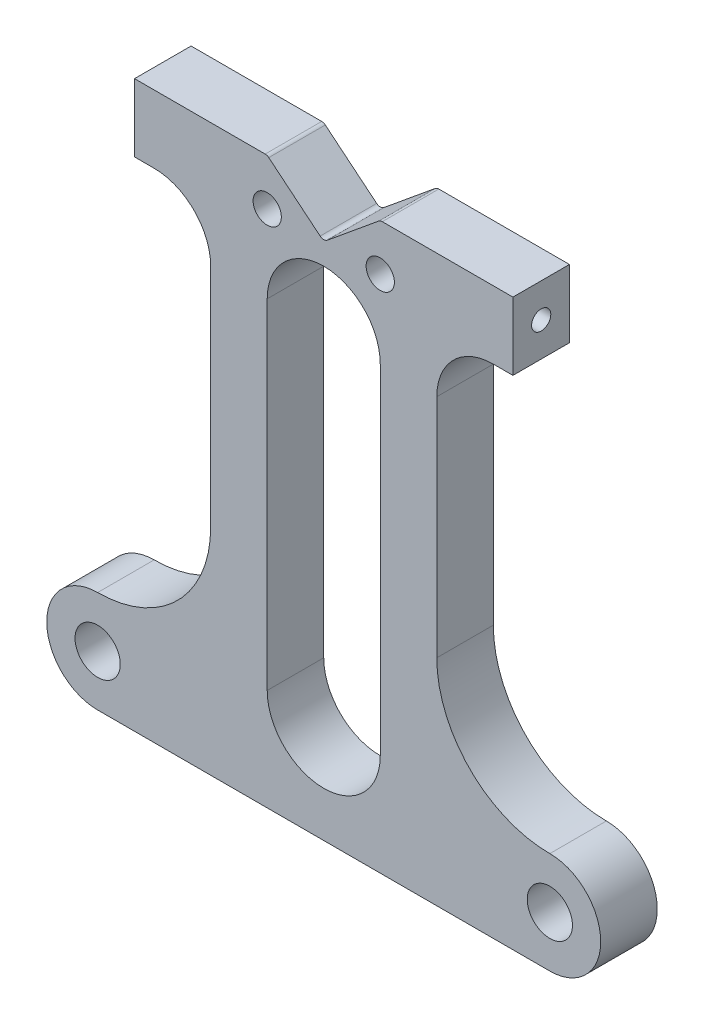
ISO-10303-21;
HEADER;
FILE_DESCRIPTION(('STEP AP214'),'2;1');
FILE_NAME('part.step','',(''),(''),'','','');
FILE_SCHEMA(('AUTOMOTIVE_DESIGN { 1 0 10303 214 1 1 1 1 }'));
ENDSEC;
DATA;
#1=APPLICATION_CONTEXT('core data for automotive mechanical design processes');
#2=APPLICATION_PROTOCOL_DEFINITION('international standard','automotive_design',2000,#1);
#3=PRODUCT_CONTEXT('',#1,'mechanical');
#4=PRODUCT('Part','Part','',(#3));
#5=PRODUCT_RELATED_PRODUCT_CATEGORY('part','',(#4));
#6=PRODUCT_DEFINITION_FORMATION('','',#4);
#7=PRODUCT_DEFINITION_CONTEXT('part definition',#1,'design');
#8=PRODUCT_DEFINITION('design','',#6,#7);
#9=PRODUCT_DEFINITION_SHAPE('','',#8);
#10=(LENGTH_UNIT() NAMED_UNIT(*) SI_UNIT(.MILLI.,.METRE.));
#11=(NAMED_UNIT(*) PLANE_ANGLE_UNIT() SI_UNIT($,.RADIAN.));
#12=(NAMED_UNIT(*) SI_UNIT($,.STERADIAN.) SOLID_ANGLE_UNIT());
#13=UNCERTAINTY_MEASURE_WITH_UNIT(LENGTH_MEASURE(1.E-05),#10,'distance_accuracy_value','');
#14=(GEOMETRIC_REPRESENTATION_CONTEXT(3) GLOBAL_UNCERTAINTY_ASSIGNED_CONTEXT((#13)) GLOBAL_UNIT_ASSIGNED_CONTEXT((#10,
#11,#12)) REPRESENTATION_CONTEXT('',''));
#15=CARTESIAN_POINT('',(0.,0.,0.));
#16=DIRECTION('',(0.,0.,1.));
#17=DIRECTION('',(1.,0.,0.));
#18=AXIS2_PLACEMENT_3D('',#15,#16,#17);
#19=CARTESIAN_POINT('',(0.,-9.00000000000001,5.));
#20=DIRECTION('',(0.,-1.,0.));
#21=DIRECTION('',(1.,0.,0.));
#22=AXIS2_PLACEMENT_3D('',#19,#20,#21);
#23=PLANE('',#22);
#24=DIRECTION('',(-1.,0.,0.));
#25=VECTOR('',#24,1.);
#26=CARTESIAN_POINT('',(0.,-9.00000000000001,-5.));
#27=LINE('',#26,#25);
#28=CARTESIAN_POINT('',(40.,-9.,-5.));
#29=VERTEX_POINT('',#28);
#30=CARTESIAN_POINT('',(-40.,-9.,-5.));
#31=VERTEX_POINT('',#30);
#32=EDGE_CURVE('E338',#29,#31,#27,.T.);
#33=ORIENTED_EDGE('',*,*,#32,.F.);
#34=DIRECTION('',(0.,0.,-1.));
#35=VECTOR('',#34,1.);
#36=CARTESIAN_POINT('',(40.,-9.,5.));
#37=LINE('',#36,#35);
#38=CARTESIAN_POINT('',(40.,-9.,5.));
#39=VERTEX_POINT('',#38);
#40=EDGE_CURVE('E465',#39,#29,#37,.T.);
#41=ORIENTED_EDGE('',*,*,#40,.F.);
#42=DIRECTION('',(-1.,0.,0.));
#43=VECTOR('',#42,1.);
#44=CARTESIAN_POINT('',(0.,-9.00000000000001,5.));
#45=LINE('',#44,#43);
#46=CARTESIAN_POINT('',(-40.,-9.,5.));
#47=VERTEX_POINT('',#46);
#48=EDGE_CURVE('E339',#39,#47,#45,.T.);
#49=ORIENTED_EDGE('',*,*,#48,.T.);
#50=DIRECTION('',(0.,0.,-1.));
#51=VECTOR('',#50,1.);
#52=CARTESIAN_POINT('',(-40.,-9.,5.));
#53=LINE('',#52,#51);
#54=EDGE_CURVE('E269',#47,#31,#53,.T.);
#55=ORIENTED_EDGE('',*,*,#54,.T.);
#56=EDGE_LOOP('',(#33,#41,#49,#55));
#57=FACE_BOUND('',#56,.T.);
#58=ADVANCED_FACE('F47',(#57),#23,.T.);
#59=CARTESIAN_POINT('',(40.,0.,5.));
#60=DIRECTION('',(0.,0.,-1.));
#61=DIRECTION('',(-1.,0.,0.));
#62=AXIS2_PLACEMENT_3D('',#59,#60,#61);
#63=CYLINDRICAL_SURFACE('',#62,9.);
#64=CARTESIAN_POINT('',(40.,0.,-5.));
#65=DIRECTION('',(0.,0.,1.));
#66=DIRECTION('',(1.,0.,0.));
#67=AXIS2_PLACEMENT_3D('',#64,#65,#66);
#68=CIRCLE('',#67,9.);
#69=CARTESIAN_POINT('',(40.,9.,-5.));
#70=VERTEX_POINT('',#69);
#71=EDGE_CURVE('E393',#29,#70,#68,.T.);
#72=ORIENTED_EDGE('',*,*,#71,.T.);
#73=DIRECTION('',(0.,0.,-1.));
#74=VECTOR('',#73,1.);
#75=CARTESIAN_POINT('',(40.,9.,5.));
#76=LINE('',#75,#74);
#77=CARTESIAN_POINT('',(40.,9.,5.));
#78=VERTEX_POINT('',#77);
#79=EDGE_CURVE('E462',#78,#70,#76,.T.);
#80=ORIENTED_EDGE('',*,*,#79,.F.);
#81=CARTESIAN_POINT('',(40.,0.,5.));
#82=DIRECTION('',(0.,0.,1.));
#83=DIRECTION('',(1.,0.,0.));
#84=AXIS2_PLACEMENT_3D('',#81,#82,#83);
#85=CIRCLE('',#84,9.);
#86=EDGE_CURVE('E342',#39,#78,#85,.T.);
#87=ORIENTED_EDGE('',*,*,#86,.F.);
#88=ORIENTED_EDGE('',*,*,#40,.T.);
#89=EDGE_LOOP('',(#72,#80,#87,#88));
#90=FACE_BOUND('',#89,.T.);
#91=ADVANCED_FACE('F565',(#90),#63,.T.);
#92=CARTESIAN_POINT('',(40.,29.,5.));
#93=DIRECTION('',(0.,0.,-1.));
#94=DIRECTION('',(-1.,0.,0.));
#95=AXIS2_PLACEMENT_3D('',#92,#93,#94);
#96=CYLINDRICAL_SURFACE('',#95,20.);
#97=CARTESIAN_POINT('',(40.,29.,-5.));
#98=DIRECTION('',(0.,0.,1.));
#99=DIRECTION('',(1.,0.,0.));
#100=AXIS2_PLACEMENT_3D('',#97,#98,#99);
#101=CIRCLE('',#100,20.);
#102=CARTESIAN_POINT('',(20.,29.,-5.));
#103=VERTEX_POINT('',#102);
#104=EDGE_CURVE('E397',#103,#70,#101,.T.);
#105=ORIENTED_EDGE('',*,*,#104,.F.);
#106=DIRECTION('',(0.,0.,-1.));
#107=VECTOR('',#106,1.);
#108=CARTESIAN_POINT('',(20.,29.,5.));
#109=LINE('',#108,#107);
#110=CARTESIAN_POINT('',(20.,29.,5.));
#111=VERTEX_POINT('',#110);
#112=EDGE_CURVE('E459',#111,#103,#109,.T.);
#113=ORIENTED_EDGE('',*,*,#112,.F.);
#114=CARTESIAN_POINT('',(40.,29.,5.));
#115=DIRECTION('',(0.,0.,1.));
#116=DIRECTION('',(1.,0.,0.));
#117=AXIS2_PLACEMENT_3D('',#114,#115,#116);
#118=CIRCLE('',#117,20.);
#119=EDGE_CURVE('E346',#111,#78,#118,.T.);
#120=ORIENTED_EDGE('',*,*,#119,.T.);
#121=ORIENTED_EDGE('',*,*,#79,.T.);
#122=EDGE_LOOP('',(#105,#113,#120,#121));
#123=FACE_BOUND('',#122,.T.);
#124=ADVANCED_FACE('F569',(#123),#96,.F.);
#125=CARTESIAN_POINT('',(20.,0.,5.));
#126=DIRECTION('',(1.,0.,0.));
#127=DIRECTION('',(0.,1.,0.));
#128=AXIS2_PLACEMENT_3D('',#125,#126,#127);
#129=PLANE('',#128);
#130=DIRECTION('',(0.,-1.,0.));
#131=VECTOR('',#130,1.);
#132=CARTESIAN_POINT('',(20.,0.,-5.));
#133=LINE('',#132,#131);
#134=CARTESIAN_POINT('',(20.,69.,-5.));
#135=VERTEX_POINT('',#134);
#136=EDGE_CURVE('E401',#135,#103,#133,.T.);
#137=ORIENTED_EDGE('',*,*,#136,.F.);
#138=DIRECTION('',(0.,0.,-1.));
#139=VECTOR('',#138,1.);
#140=CARTESIAN_POINT('',(20.,69.,5.));
#141=LINE('',#140,#139);
#142=CARTESIAN_POINT('',(20.,69.,5.));
#143=VERTEX_POINT('',#142);
#144=EDGE_CURVE('E456',#143,#135,#141,.T.);
#145=ORIENTED_EDGE('',*,*,#144,.F.);
#146=DIRECTION('',(0.,-1.,0.));
#147=VECTOR('',#146,1.);
#148=CARTESIAN_POINT('',(20.,0.,5.));
#149=LINE('',#148,#147);
#150=EDGE_CURVE('E350',#143,#111,#149,.T.);
#151=ORIENTED_EDGE('',*,*,#150,.T.);
#152=ORIENTED_EDGE('',*,*,#112,.T.);
#153=EDGE_LOOP('',(#137,#145,#151,#152));
#154=FACE_BOUND('',#153,.T.);
#155=ADVANCED_FACE('F572',(#154),#129,.T.);
#156=CARTESIAN_POINT('',(30.,69.,5.));
#157=DIRECTION('',(0.,0.,-1.));
#158=DIRECTION('',(-1.,0.,0.));
#159=AXIS2_PLACEMENT_3D('',#156,#157,#158);
#160=CYLINDRICAL_SURFACE('',#159,10.);
#161=CARTESIAN_POINT('',(30.,69.,-5.));
#162=DIRECTION('',(0.,0.,1.));
#163=DIRECTION('',(1.,0.,0.));
#164=AXIS2_PLACEMENT_3D('',#161,#162,#163);
#165=CIRCLE('',#164,10.);
#166=CARTESIAN_POINT('',(30.,79.,-5.));
#167=VERTEX_POINT('',#166);
#168=EDGE_CURVE('E405',#135,#167,#165,.F.);
#169=ORIENTED_EDGE('',*,*,#168,.T.);
#170=DIRECTION('',(0.,0.,-1.));
#171=VECTOR('',#170,1.);
#172=CARTESIAN_POINT('',(30.,79.,5.));
#173=LINE('',#172,#171);
#174=CARTESIAN_POINT('',(30.,79.,5.));
#175=VERTEX_POINT('',#174);
#176=EDGE_CURVE('E453',#175,#167,#173,.T.);
#177=ORIENTED_EDGE('',*,*,#176,.F.);
#178=CARTESIAN_POINT('',(30.,69.,5.));
#179=DIRECTION('',(0.,0.,1.));
#180=DIRECTION('',(1.,0.,0.));
#181=AXIS2_PLACEMENT_3D('',#178,#179,#180);
#182=CIRCLE('',#181,10.);
#183=EDGE_CURVE('E354',#143,#175,#182,.F.);
#184=ORIENTED_EDGE('',*,*,#183,.F.);
#185=ORIENTED_EDGE('',*,*,#144,.T.);
#186=EDGE_LOOP('',(#169,#177,#184,#185));
#187=FACE_BOUND('',#186,.T.);
#188=ADVANCED_FACE('F578',(#187),#160,.F.);
#189=CARTESIAN_POINT('',(3.15949635970416E-13,79.0000000000001,5.));
#190=DIRECTION('',(0.,-1.,0.));
#191=DIRECTION('',(1.,0.,0.));
#192=AXIS2_PLACEMENT_3D('',#189,#190,#191);
#193=PLANE('',#192);
#194=DIRECTION('',(-1.,0.,0.));
#195=VECTOR('',#194,1.);
#196=CARTESIAN_POINT('',(3.15949635970416E-13,79.0000000000001,-5.));
#197=LINE('',#196,#195);
#198=CARTESIAN_POINT('',(33.47,79.,-5.));
#199=VERTEX_POINT('',#198);
#200=EDGE_CURVE('E409',#199,#167,#197,.T.);
#201=ORIENTED_EDGE('',*,*,#200,.F.);
#202=DIRECTION('',(0.,0.,-1.));
#203=VECTOR('',#202,1.);
#204=CARTESIAN_POINT('',(33.47,79.,5.));
#205=LINE('',#204,#203);
#206=CARTESIAN_POINT('',(33.47,79.,5.));
#207=VERTEX_POINT('',#206);
#208=EDGE_CURVE('E450',#207,#199,#205,.T.);
#209=ORIENTED_EDGE('',*,*,#208,.F.);
#210=DIRECTION('',(-1.,0.,0.));
#211=VECTOR('',#210,1.);
#212=CARTESIAN_POINT('',(3.15949635970416E-13,79.0000000000001,5.));
#213=LINE('',#212,#211);
#214=EDGE_CURVE('E357',#207,#175,#213,.T.);
#215=ORIENTED_EDGE('',*,*,#214,.T.);
#216=ORIENTED_EDGE('',*,*,#176,.T.);
#217=EDGE_LOOP('',(#201,#209,#215,#216));
#218=FACE_BOUND('',#217,.T.);
#219=ADVANCED_FACE('F582',(#218),#193,.T.);
#220=CARTESIAN_POINT('',(33.47,0.,5.));
#221=DIRECTION('',(1.,0.,0.));
#222=DIRECTION('',(0.,0.,-1.));
#223=AXIS2_PLACEMENT_3D('',#220,#221,#222);
#224=PLANE('',#223);
#225=CARTESIAN_POINT('',(33.47,85.,0.));
#226=DIRECTION('',(1.,0.,0.));
#227=DIRECTION('',(0.,0.,-1.));
#228=AXIS2_PLACEMENT_3D('',#225,#226,#227);
#229=CIRCLE('',#228,1.69999999999999);
#230=CARTESIAN_POINT('',(33.47,85.,-1.69999999999999));
#231=VERTEX_POINT('',#230);
#232=EDGE_CURVE('E220',#231,#231,#229,.T.);
#233=ORIENTED_EDGE('',*,*,#232,.F.);
#234=EDGE_LOOP('',(#233));
#235=FACE_BOUND('',#234,.T.);
#236=DIRECTION('',(0.,-1.,0.));
#237=VECTOR('',#236,1.);
#238=CARTESIAN_POINT('',(33.47,0.,-5.));
#239=LINE('',#238,#237);
#240=CARTESIAN_POINT('',(33.47,91.,-5.));
#241=VERTEX_POINT('',#240);
#242=EDGE_CURVE('E413',#241,#199,#239,.T.);
#243=ORIENTED_EDGE('',*,*,#242,.F.);
#244=DIRECTION('',(0.,0.,-1.));
#245=VECTOR('',#244,1.);
#246=CARTESIAN_POINT('',(33.47,91.,5.));
#247=LINE('',#246,#245);
#248=CARTESIAN_POINT('',(33.47,91.,5.));
#249=VERTEX_POINT('',#248);
#250=EDGE_CURVE('E446',#249,#241,#247,.T.);
#251=ORIENTED_EDGE('',*,*,#250,.F.);
#252=DIRECTION('',(0.,-1.,0.));
#253=VECTOR('',#252,1.);
#254=CARTESIAN_POINT('',(33.47,0.,5.));
#255=LINE('',#254,#253);
#256=EDGE_CURVE('E361',#249,#207,#255,.T.);
#257=ORIENTED_EDGE('',*,*,#256,.T.);
#258=ORIENTED_EDGE('',*,*,#208,.T.);
#259=EDGE_LOOP('',(#243,#251,#257,#258));
#260=FACE_BOUND('',#259,.T.);
#261=ADVANCED_FACE('F585',(#235,#260),#224,.T.);
#262=CARTESIAN_POINT('',(0.,91.,5.));
#263=DIRECTION('',(0.,1.,0.));
#264=DIRECTION('',(0.,0.,1.));
#265=AXIS2_PLACEMENT_3D('',#262,#263,#264);
#266=PLANE('',#265);
#267=DIRECTION('',(1.,0.,0.));
#268=VECTOR('',#267,1.);
#269=CARTESIAN_POINT('',(0.,91.,-5.));
#270=LINE('',#269,#268);
#271=CARTESIAN_POINT('',(10.3583764703025,91.,-5.));
#272=VERTEX_POINT('',#271);
#273=EDGE_CURVE('E417',#272,#241,#270,.T.);
#274=ORIENTED_EDGE('',*,*,#273,.F.);
#275=DIRECTION('',(0.,0.,-1.));
#276=VECTOR('',#275,1.);
#277=CARTESIAN_POINT('',(10.3583764703025,91.,5.));
#278=LINE('',#277,#276);
#279=CARTESIAN_POINT('',(10.3583764703025,91.,5.));
#280=VERTEX_POINT('',#279);
#281=EDGE_CURVE('E63',#272,#280,#278,.F.);
#282=ORIENTED_EDGE('',*,*,#281,.T.);
#283=DIRECTION('',(1.,0.,0.));
#284=VECTOR('',#283,1.);
#285=CARTESIAN_POINT('',(0.,91.,5.));
#286=LINE('',#285,#284);
#287=EDGE_CURVE('E365',#280,#249,#286,.T.);
#288=ORIENTED_EDGE('',*,*,#287,.T.);
#289=ORIENTED_EDGE('',*,*,#250,.T.);
#290=EDGE_LOOP('',(#274,#282,#288,#289));
#291=FACE_BOUND('',#290,.T.);
#292=ADVANCED_FACE('F668',(#291),#266,.T.);
#293=CARTESIAN_POINT('',(-40.6091273121016,49.3804002149911,5.));
#294=DIRECTION('',(-0.635175060900593,0.772368203650259,0.));
#295=DIRECTION('',(-0.772368203650259,-0.635175060900593,0.));
#296=AXIS2_PLACEMENT_3D('',#293,#294,#295);
#297=PLANE('',#296);
#298=DIRECTION('',(0.772368203650259,0.635175060900593,0.));
#299=VECTOR('',#298,1.);
#300=CARTESIAN_POINT('',(-40.6091273121016,49.3804002149911,-5.));
#301=LINE('',#300,#299);
#302=CARTESIAN_POINT('',(0.635175060900599,83.2986171324715,-5.));
#303=VERTEX_POINT('',#302);
#304=CARTESIAN_POINT('',(9.72320140940192,90.7723682036503,-5.));
#305=VERTEX_POINT('',#304);
#306=EDGE_CURVE('E420',#303,#305,#301,.T.);
#307=ORIENTED_EDGE('',*,*,#306,.F.);
#308=DIRECTION('',(0.,0.,-1.));
#309=VECTOR('',#308,1.);
#310=CARTESIAN_POINT('',(0.635175060900599,83.2986171324715,5.));
#311=LINE('',#310,#309);
#312=CARTESIAN_POINT('',(0.635175060900599,83.2986171324715,5.));
#313=VERTEX_POINT('',#312);
#314=EDGE_CURVE('E479',#303,#313,#311,.F.);
#315=ORIENTED_EDGE('',*,*,#314,.T.);
#316=DIRECTION('',(0.772368203650259,0.635175060900593,0.));
#317=VECTOR('',#316,1.);
#318=CARTESIAN_POINT('',(-40.6091273121016,49.3804002149911,5.));
#319=LINE('',#318,#317);
#320=CARTESIAN_POINT('',(9.72320140940192,90.7723682036503,5.));
#321=VERTEX_POINT('',#320);
#322=EDGE_CURVE('E368',#313,#321,#319,.T.);
#323=ORIENTED_EDGE('',*,*,#322,.T.);
#324=DIRECTION('',(0.,0.,-1.));
#325=VECTOR('',#324,1.);
#326=CARTESIAN_POINT('',(9.72320140940192,90.7723682036503,5.));
#327=LINE('',#326,#325);
#328=EDGE_CURVE('E475',#321,#305,#327,.T.);
#329=ORIENTED_EDGE('',*,*,#328,.T.);
#330=EDGE_LOOP('',(#307,#315,#323,#329));
#331=FACE_BOUND('',#330,.T.);
#332=ADVANCED_FACE('F508',(#331),#297,.T.);
#333=CARTESIAN_POINT('',(0.,69.,5.));
#334=DIRECTION('',(0.,0.,-1.));
#335=DIRECTION('',(-1.,0.,0.));
#336=AXIS2_PLACEMENT_3D('',#333,#334,#335);
#337=CYLINDRICAL_SURFACE('',#336,10.);
#338=CARTESIAN_POINT('',(0.,69.,-5.));
#339=DIRECTION('',(0.,0.,1.));
#340=DIRECTION('',(1.,0.,0.));
#341=AXIS2_PLACEMENT_3D('',#338,#339,#340);
#342=CIRCLE('',#341,10.);
#343=CARTESIAN_POINT('',(10.,69.,-5.));
#344=VERTEX_POINT('',#343);
#345=CARTESIAN_POINT('',(-10.,69.,-5.));
#346=VERTEX_POINT('',#345);
#347=EDGE_CURVE('E423',#344,#346,#342,.T.);
#348=ORIENTED_EDGE('',*,*,#347,.F.);
#349=DIRECTION('',(0.,0.,-1.));
#350=VECTOR('',#349,1.);
#351=CARTESIAN_POINT('',(10.,69.,5.));
#352=LINE('',#351,#350);
#353=CARTESIAN_POINT('',(10.,69.,5.));
#354=VERTEX_POINT('',#353);
#355=EDGE_CURVE('E443',#354,#344,#352,.T.);
#356=ORIENTED_EDGE('',*,*,#355,.F.);
#357=CARTESIAN_POINT('',(0.,69.,5.));
#358=DIRECTION('',(0.,0.,1.));
#359=DIRECTION('',(1.,0.,0.));
#360=AXIS2_PLACEMENT_3D('',#357,#358,#359);
#361=CIRCLE('',#360,10.);
#362=CARTESIAN_POINT('',(-10.,69.,5.));
#363=VERTEX_POINT('',#362);
#364=EDGE_CURVE('E372',#354,#363,#361,.T.);
#365=ORIENTED_EDGE('',*,*,#364,.T.);
#366=DIRECTION('',(0.,0.,-1.));
#367=VECTOR('',#366,1.);
#368=CARTESIAN_POINT('',(-10.,69.,5.));
#369=LINE('',#368,#367);
#370=EDGE_CURVE('E330',#363,#346,#369,.T.);
#371=ORIENTED_EDGE('',*,*,#370,.T.);
#372=EDGE_LOOP('',(#348,#356,#365,#371));
#373=FACE_BOUND('',#372,.T.);
#374=ADVANCED_FACE('F662',(#373),#337,.F.);
#375=CARTESIAN_POINT('',(10.,0.,5.));
#376=DIRECTION('',(1.,0.,0.));
#377=DIRECTION('',(0.,1.,0.));
#378=AXIS2_PLACEMENT_3D('',#375,#376,#377);
#379=PLANE('',#378);
#380=DIRECTION('',(0.,-1.,0.));
#381=VECTOR('',#380,1.);
#382=CARTESIAN_POINT('',(10.,0.,-5.));
#383=LINE('',#382,#381);
#384=CARTESIAN_POINT('',(10.,9.00000000000001,-5.));
#385=VERTEX_POINT('',#384);
#386=EDGE_CURVE('E426',#344,#385,#383,.T.);
#387=ORIENTED_EDGE('',*,*,#386,.T.);
#388=DIRECTION('',(0.,0.,-1.));
#389=VECTOR('',#388,1.);
#390=CARTESIAN_POINT('',(10.,9.00000000000001,5.));
#391=LINE('',#390,#389);
#392=CARTESIAN_POINT('',(10.,9.00000000000001,5.));
#393=VERTEX_POINT('',#392);
#394=EDGE_CURVE('E390',#393,#385,#391,.T.);
#395=ORIENTED_EDGE('',*,*,#394,.F.);
#396=DIRECTION('',(0.,-1.,0.));
#397=VECTOR('',#396,1.);
#398=CARTESIAN_POINT('',(10.,0.,5.));
#399=LINE('',#398,#397);
#400=EDGE_CURVE('E375',#354,#393,#399,.T.);
#401=ORIENTED_EDGE('',*,*,#400,.F.);
#402=ORIENTED_EDGE('',*,*,#355,.T.);
#403=EDGE_LOOP('',(#387,#395,#401,#402));
#404=FACE_BOUND('',#403,.T.);
#405=ADVANCED_FACE('F658',(#404),#379,.F.);
#406=CARTESIAN_POINT('',(0.,9.00000000000001,5.));
#407=DIRECTION('',(0.,0.,-1.));
#408=DIRECTION('',(-1.,0.,0.));
#409=AXIS2_PLACEMENT_3D('',#406,#407,#408);
#410=CYLINDRICAL_SURFACE('',#409,10.);
#411=CARTESIAN_POINT('',(0.,9.00000000000001,-5.));
#412=DIRECTION('',(0.,0.,1.));
#413=DIRECTION('',(1.,0.,0.));
#414=AXIS2_PLACEMENT_3D('',#411,#412,#413);
#415=CIRCLE('',#414,10.);
#416=CARTESIAN_POINT('',(-10.,9.00000000000001,-5.));
#417=VERTEX_POINT('',#416);
#418=EDGE_CURVE('E430',#417,#385,#415,.T.);
#419=ORIENTED_EDGE('',*,*,#418,.F.);
#420=DIRECTION('',(0.,0.,-1.));
#421=VECTOR('',#420,1.);
#422=CARTESIAN_POINT('',(-10.,9.00000000000001,5.));
#423=LINE('',#422,#421);
#424=CARTESIAN_POINT('',(-10.,9.00000000000001,5.));
#425=VERTEX_POINT('',#424);
#426=EDGE_CURVE('E334',#425,#417,#423,.T.);
#427=ORIENTED_EDGE('',*,*,#426,.F.);
#428=CARTESIAN_POINT('',(0.,9.00000000000001,5.));
#429=DIRECTION('',(0.,0.,1.));
#430=DIRECTION('',(1.,0.,0.));
#431=AXIS2_PLACEMENT_3D('',#428,#429,#430);
#432=CIRCLE('',#431,10.);
#433=EDGE_CURVE('E378',#425,#393,#432,.T.);
#434=ORIENTED_EDGE('',*,*,#433,.T.);
#435=ORIENTED_EDGE('',*,*,#394,.T.);
#436=EDGE_LOOP('',(#419,#427,#434,#435));
#437=FACE_BOUND('',#436,.T.);
#438=ADVANCED_FACE('F654',(#437),#410,.F.);
#439=CARTESIAN_POINT('',(10.,82.7762660619803,5.));
#440=DIRECTION('',(0.,0.,-1.));
#441=DIRECTION('',(-1.,0.,0.));
#442=AXIS2_PLACEMENT_3D('',#439,#440,#441);
#443=CYLINDRICAL_SURFACE('',#442,2.5);
#444=CARTESIAN_POINT('',(10.,82.7762660619803,5.));
#445=DIRECTION('',(0.,0.,1.));
#446=DIRECTION('',(1.,0.,0.));
#447=AXIS2_PLACEMENT_3D('',#444,#445,#446);
#448=CIRCLE('',#447,2.5);
#449=CARTESIAN_POINT('',(12.5,82.7762660619803,5.));
#450=VERTEX_POINT('',#449);
#451=EDGE_CURVE('E382',#450,#450,#448,.T.);
#452=ORIENTED_EDGE('',*,*,#451,.T.);
#453=EDGE_LOOP('',(#452));
#454=FACE_BOUND('',#453,.T.);
#455=CARTESIAN_POINT('',(10.,82.7762660619803,-5.));
#456=DIRECTION('',(0.,0.,1.));
#457=DIRECTION('',(1.,0.,0.));
#458=AXIS2_PLACEMENT_3D('',#455,#456,#457);
#459=CIRCLE('',#458,2.5);
#460=CARTESIAN_POINT('',(12.5,82.7762660619803,-5.));
#461=VERTEX_POINT('',#460);
#462=EDGE_CURVE('E434',#461,#461,#459,.T.);
#463=ORIENTED_EDGE('',*,*,#462,.F.);
#464=EDGE_LOOP('',(#463));
#465=FACE_BOUND('',#464,.T.);
#466=ADVANCED_FACE('F650',(#454,#465),#443,.F.);
#467=CARTESIAN_POINT('',(40.,0.,5.));
#468=DIRECTION('',(0.,0.,-1.));
#469=DIRECTION('',(-1.,0.,0.));
#470=AXIS2_PLACEMENT_3D('',#467,#468,#469);
#471=CYLINDRICAL_SURFACE('',#470,4.);
#472=CARTESIAN_POINT('',(40.,0.,5.));
#473=DIRECTION('',(0.,0.,1.));
#474=DIRECTION('',(1.,0.,0.));
#475=AXIS2_PLACEMENT_3D('',#472,#473,#474);
#476=CIRCLE('',#475,4.);
#477=CARTESIAN_POINT('',(44.,0.,5.));
#478=VERTEX_POINT('',#477);
#479=EDGE_CURVE('E386',#478,#478,#476,.T.);
#480=ORIENTED_EDGE('',*,*,#479,.T.);
#481=EDGE_LOOP('',(#480));
#482=FACE_BOUND('',#481,.T.);
#483=CARTESIAN_POINT('',(40.,0.,-5.));
#484=DIRECTION('',(0.,0.,1.));
#485=DIRECTION('',(1.,0.,0.));
#486=AXIS2_PLACEMENT_3D('',#483,#484,#485);
#487=CIRCLE('',#486,4.);
#488=CARTESIAN_POINT('',(44.,0.,-5.));
#489=VERTEX_POINT('',#488);
#490=EDGE_CURVE('E343',#489,#489,#487,.T.);
#491=ORIENTED_EDGE('',*,*,#490,.F.);
#492=EDGE_LOOP('',(#491));
#493=FACE_BOUND('',#492,.T.);
#494=ADVANCED_FACE('F644',(#482,#493),#471,.F.);
#495=CARTESIAN_POINT('',(0.,0.,5.));
#496=DIRECTION('',(0.,0.,1.));
#497=DIRECTION('',(1.,0.,0.));
#498=AXIS2_PLACEMENT_3D('',#495,#496,#497);
#499=PLANE('',#498);
#500=ORIENTED_EDGE('',*,*,#433,.F.);
#501=DIRECTION('',(0.,-1.,0.));
#502=VECTOR('',#501,1.);
#503=CARTESIAN_POINT('',(-10.,0.,5.));
#504=LINE('',#503,#502);
#505=EDGE_CURVE('E230',#363,#425,#504,.T.);
#506=ORIENTED_EDGE('',*,*,#505,.F.);
#507=ORIENTED_EDGE('',*,*,#364,.F.);
#508=ORIENTED_EDGE('',*,*,#400,.T.);
#509=EDGE_LOOP('',(#500,#506,#507,#508));
#510=FACE_BOUND('',#509,.T.);
#511=DIRECTION('',(-0.772368203650259,0.635175060900593,0.));
#512=VECTOR('',#511,1.);
#513=CARTESIAN_POINT('',(40.6091273121016,49.3804002149911,5.));
#514=LINE('',#513,#512);
#515=CARTESIAN_POINT('',(-0.635175060900599,83.2986171324715,5.));
#516=VERTEX_POINT('',#515);
#517=CARTESIAN_POINT('',(-9.72320140940192,90.7723682036503,5.));
#518=VERTEX_POINT('',#517);
#519=EDGE_CURVE('E234',#516,#518,#514,.T.);
#520=ORIENTED_EDGE('',*,*,#519,.T.);
#521=CARTESIAN_POINT('',(-10.3583764703025,90.,5.));
#522=DIRECTION('',(0.,0.,1.));
#523=DIRECTION('',(1.,0.,0.));
#524=AXIS2_PLACEMENT_3D('',#521,#522,#523);
#525=CIRCLE('',#524,1.);
#526=CARTESIAN_POINT('',(-10.3583764703025,91.,5.));
#527=VERTEX_POINT('',#526);
#528=EDGE_CURVE('E494',#518,#527,#525,.T.);
#529=ORIENTED_EDGE('',*,*,#528,.T.);
#530=DIRECTION('',(-1.,0.,0.));
#531=VECTOR('',#530,1.);
#532=CARTESIAN_POINT('',(0.,91.,5.));
#533=LINE('',#532,#531);
#534=CARTESIAN_POINT('',(-33.47,91.,5.));
#535=VERTEX_POINT('',#534);
#536=EDGE_CURVE('E239',#527,#535,#533,.T.);
#537=ORIENTED_EDGE('',*,*,#536,.T.);
#538=DIRECTION('',(0.,-1.,0.));
#539=VECTOR('',#538,1.);
#540=CARTESIAN_POINT('',(-33.47,0.,5.));
#541=LINE('',#540,#539);
#542=CARTESIAN_POINT('',(-33.47,79.,5.));
#543=VERTEX_POINT('',#542);
#544=EDGE_CURVE('E242',#535,#543,#541,.T.);
#545=ORIENTED_EDGE('',*,*,#544,.T.);
#546=DIRECTION('',(1.,0.,0.));
#547=VECTOR('',#546,1.);
#548=CARTESIAN_POINT('',(-3.15949635970416E-13,79.0000000000001,5.));
#549=LINE('',#548,#547);
#550=CARTESIAN_POINT('',(-30.,79.,5.));
#551=VERTEX_POINT('',#550);
#552=EDGE_CURVE('E245',#543,#551,#549,.T.);
#553=ORIENTED_EDGE('',*,*,#552,.T.);
#554=CARTESIAN_POINT('',(-30.,69.,5.));
#555=DIRECTION('',(0.,0.,-1.));
#556=DIRECTION('',(-1.,0.,0.));
#557=AXIS2_PLACEMENT_3D('',#554,#555,#556);
#558=CIRCLE('',#557,10.);
#559=CARTESIAN_POINT('',(-20.,69.,5.));
#560=VERTEX_POINT('',#559);
#561=EDGE_CURVE('E248',#560,#551,#558,.F.);
#562=ORIENTED_EDGE('',*,*,#561,.F.);
#563=DIRECTION('',(0.,-1.,0.));
#564=VECTOR('',#563,1.);
#565=CARTESIAN_POINT('',(-20.,0.,5.));
#566=LINE('',#565,#564);
#567=CARTESIAN_POINT('',(-20.,29.,5.));
#568=VERTEX_POINT('',#567);
#569=EDGE_CURVE('E252',#560,#568,#566,.T.);
#570=ORIENTED_EDGE('',*,*,#569,.T.);
#571=CARTESIAN_POINT('',(-40.,29.,5.));
#572=DIRECTION('',(0.,0.,-1.));
#573=DIRECTION('',(-1.,0.,0.));
#574=AXIS2_PLACEMENT_3D('',#571,#572,#573);
#575=CIRCLE('',#574,20.);
#576=CARTESIAN_POINT('',(-40.,9.,5.));
#577=VERTEX_POINT('',#576);
#578=EDGE_CURVE('E255',#568,#577,#575,.T.);
#579=ORIENTED_EDGE('',*,*,#578,.T.);
#580=CARTESIAN_POINT('',(-40.,0.,5.));
#581=DIRECTION('',(0.,0.,-1.));
#582=DIRECTION('',(-1.,0.,0.));
#583=AXIS2_PLACEMENT_3D('',#580,#581,#582);
#584=CIRCLE('',#583,9.);
#585=EDGE_CURVE('E258',#47,#577,#584,.T.);
#586=ORIENTED_EDGE('',*,*,#585,.F.);
#587=ORIENTED_EDGE('',*,*,#48,.F.);
#588=ORIENTED_EDGE('',*,*,#86,.T.);
#589=ORIENTED_EDGE('',*,*,#119,.F.);
#590=ORIENTED_EDGE('',*,*,#150,.F.);
#591=ORIENTED_EDGE('',*,*,#183,.T.);
#592=ORIENTED_EDGE('',*,*,#214,.F.);
#593=ORIENTED_EDGE('',*,*,#256,.F.);
#594=ORIENTED_EDGE('',*,*,#287,.F.);
#595=CARTESIAN_POINT('',(10.3583764703025,90.,5.));
#596=DIRECTION('',(0.,0.,1.));
#597=DIRECTION('',(1.,0.,0.));
#598=AXIS2_PLACEMENT_3D('',#595,#596,#597);
#599=CIRCLE('',#598,1.);
#600=EDGE_CURVE('E491',#280,#321,#599,.T.);
#601=ORIENTED_EDGE('',*,*,#600,.T.);
#602=ORIENTED_EDGE('',*,*,#322,.F.);
#603=CARTESIAN_POINT('',(0.,84.0709853361218,5.));
#604=DIRECTION('',(0.,0.,1.));
#605=DIRECTION('',(1.,0.,0.));
#606=AXIS2_PLACEMENT_3D('',#603,#604,#605);
#607=CIRCLE('',#606,1.);
#608=EDGE_CURVE('E11',#313,#516,#607,.F.);
#609=ORIENTED_EDGE('',*,*,#608,.T.);
#610=EDGE_LOOP('',(#520,#529,#537,#545,#553,#562,#570,#579,#586,#587,#588,#589,#590,#591,#592,
#593,#594,#601,#602,#609));
#611=FACE_BOUND('',#610,.T.);
#612=ORIENTED_EDGE('',*,*,#451,.F.);
#613=EDGE_LOOP('',(#612));
#614=FACE_BOUND('',#613,.T.);
#615=ORIENTED_EDGE('',*,*,#479,.F.);
#616=EDGE_LOOP('',(#615));
#617=FACE_BOUND('',#616,.T.);
#618=CARTESIAN_POINT('',(-10.,82.7762660619803,5.));
#619=DIRECTION('',(0.,0.,-1.));
#620=DIRECTION('',(-1.,0.,0.));
#621=AXIS2_PLACEMENT_3D('',#618,#619,#620);
#622=CIRCLE('',#621,2.5);
#623=CARTESIAN_POINT('',(-12.5,82.7762660619803,5.));
#624=VERTEX_POINT('',#623);
#625=EDGE_CURVE('E262',#624,#624,#622,.T.);
#626=ORIENTED_EDGE('',*,*,#625,.T.);
#627=EDGE_LOOP('',(#626));
#628=FACE_BOUND('',#627,.T.);
#629=CARTESIAN_POINT('',(-40.,0.,5.));
#630=DIRECTION('',(0.,0.,-1.));
#631=DIRECTION('',(-1.,0.,0.));
#632=AXIS2_PLACEMENT_3D('',#629,#630,#631);
#633=CIRCLE('',#632,4.);
#634=CARTESIAN_POINT('',(-44.,0.,5.));
#635=VERTEX_POINT('',#634);
#636=EDGE_CURVE('E266',#635,#635,#633,.T.);
#637=ORIENTED_EDGE('',*,*,#636,.T.);
#638=EDGE_LOOP('',(#637));
#639=FACE_BOUND('',#638,.T.);
#640=ADVANCED_FACE('F515',(#510,#611,#614,#617,#628,#639),#499,.T.);
#641=CARTESIAN_POINT('',(0.,0.,-5.));
#642=DIRECTION('',(0.,0.,1.));
#643=DIRECTION('',(1.,0.,0.));
#644=AXIS2_PLACEMENT_3D('',#641,#642,#643);
#645=PLANE('',#644);
#646=DIRECTION('',(0.,-1.,0.));
#647=VECTOR('',#646,1.);
#648=CARTESIAN_POINT('',(-10.,0.,-5.));
#649=LINE('',#648,#647);
#650=EDGE_CURVE('E219',#346,#417,#649,.T.);
#651=ORIENTED_EDGE('',*,*,#650,.T.);
#652=ORIENTED_EDGE('',*,*,#418,.T.);
#653=ORIENTED_EDGE('',*,*,#386,.F.);
#654=ORIENTED_EDGE('',*,*,#347,.T.);
#655=EDGE_LOOP('',(#651,#652,#653,#654));
#656=FACE_BOUND('',#655,.T.);
#657=DIRECTION('',(-1.,0.,0.));
#658=VECTOR('',#657,1.);
#659=CARTESIAN_POINT('',(0.,91.,-5.));
#660=LINE('',#659,#658);
#661=CARTESIAN_POINT('',(-10.3583764703025,91.,-5.));
#662=VERTEX_POINT('',#661);
#663=CARTESIAN_POINT('',(-33.47,91.,-5.));
#664=VERTEX_POINT('',#663);
#665=EDGE_CURVE('E274',#662,#664,#660,.T.);
#666=ORIENTED_EDGE('',*,*,#665,.F.);
#667=CARTESIAN_POINT('',(-10.3583764703025,90.,-5.));
#668=DIRECTION('',(0.,0.,1.));
#669=DIRECTION('',(1.,0.,0.));
#670=AXIS2_PLACEMENT_3D('',#667,#668,#669);
#671=CIRCLE('',#670,1.);
#672=CARTESIAN_POINT('',(-9.72320140940192,90.7723682036503,-5.));
#673=VERTEX_POINT('',#672);
#674=EDGE_CURVE('E488',#662,#673,#671,.F.);
#675=ORIENTED_EDGE('',*,*,#674,.T.);
#676=DIRECTION('',(-0.772368203650259,0.635175060900593,0.));
#677=VECTOR('',#676,1.);
#678=CARTESIAN_POINT('',(40.6091273121016,49.3804002149911,-5.));
#679=LINE('',#678,#677);
#680=CARTESIAN_POINT('',(-0.635175060900599,83.2986171324715,-5.));
#681=VERTEX_POINT('',#680);
#682=EDGE_CURVE('E225',#681,#673,#679,.T.);
#683=ORIENTED_EDGE('',*,*,#682,.F.);
#684=CARTESIAN_POINT('',(0.,84.0709853361218,-5.));
#685=DIRECTION('',(0.,0.,1.));
#686=DIRECTION('',(1.,0.,0.));
#687=AXIS2_PLACEMENT_3D('',#684,#685,#686);
#688=CIRCLE('',#687,1.);
#689=EDGE_CURVE('E56',#681,#303,#688,.T.);
#690=ORIENTED_EDGE('',*,*,#689,.T.);
#691=ORIENTED_EDGE('',*,*,#306,.T.);
#692=CARTESIAN_POINT('',(10.3583764703025,90.,-5.));
#693=DIRECTION('',(0.,0.,1.));
#694=DIRECTION('',(1.,0.,0.));
#695=AXIS2_PLACEMENT_3D('',#692,#693,#694);
#696=CIRCLE('',#695,1.);
#697=EDGE_CURVE('E71',#305,#272,#696,.F.);
#698=ORIENTED_EDGE('',*,*,#697,.T.);
#699=ORIENTED_EDGE('',*,*,#273,.T.);
#700=ORIENTED_EDGE('',*,*,#242,.T.);
#701=ORIENTED_EDGE('',*,*,#200,.T.);
#702=ORIENTED_EDGE('',*,*,#168,.F.);
#703=ORIENTED_EDGE('',*,*,#136,.T.);
#704=ORIENTED_EDGE('',*,*,#104,.T.);
#705=ORIENTED_EDGE('',*,*,#71,.F.);
#706=ORIENTED_EDGE('',*,*,#32,.T.);
#707=CARTESIAN_POINT('',(-40.,0.,-5.));
#708=DIRECTION('',(0.,0.,-1.));
#709=DIRECTION('',(-1.,0.,0.));
#710=AXIS2_PLACEMENT_3D('',#707,#708,#709);
#711=CIRCLE('',#710,9.);
#712=CARTESIAN_POINT('',(-40.,9.,-5.));
#713=VERTEX_POINT('',#712);
#714=EDGE_CURVE('E295',#31,#713,#711,.T.);
#715=ORIENTED_EDGE('',*,*,#714,.T.);
#716=CARTESIAN_POINT('',(-40.,29.,-5.));
#717=DIRECTION('',(0.,0.,-1.));
#718=DIRECTION('',(-1.,0.,0.));
#719=AXIS2_PLACEMENT_3D('',#716,#717,#718);
#720=CIRCLE('',#719,20.);
#721=CARTESIAN_POINT('',(-20.,29.,-5.));
#722=VERTEX_POINT('',#721);
#723=EDGE_CURVE('E291',#722,#713,#720,.T.);
#724=ORIENTED_EDGE('',*,*,#723,.F.);
#725=DIRECTION('',(0.,-1.,0.));
#726=VECTOR('',#725,1.);
#727=CARTESIAN_POINT('',(-20.,0.,-5.));
#728=LINE('',#727,#726);
#729=CARTESIAN_POINT('',(-20.,69.,-5.));
#730=VERTEX_POINT('',#729);
#731=EDGE_CURVE('E288',#730,#722,#728,.T.);
#732=ORIENTED_EDGE('',*,*,#731,.F.);
#733=CARTESIAN_POINT('',(-30.,69.,-5.));
#734=DIRECTION('',(0.,0.,-1.));
#735=DIRECTION('',(-1.,0.,0.));
#736=AXIS2_PLACEMENT_3D('',#733,#734,#735);
#737=CIRCLE('',#736,10.);
#738=CARTESIAN_POINT('',(-30.,79.,-5.));
#739=VERTEX_POINT('',#738);
#740=EDGE_CURVE('E284',#730,#739,#737,.F.);
#741=ORIENTED_EDGE('',*,*,#740,.T.);
#742=DIRECTION('',(1.,0.,0.));
#743=VECTOR('',#742,1.);
#744=CARTESIAN_POINT('',(-3.15949635970416E-13,79.0000000000001,-5.));
#745=LINE('',#744,#743);
#746=CARTESIAN_POINT('',(-33.47,79.,-5.));
#747=VERTEX_POINT('',#746);
#748=EDGE_CURVE('E280',#747,#739,#745,.T.);
#749=ORIENTED_EDGE('',*,*,#748,.F.);
#750=DIRECTION('',(0.,-1.,0.));
#751=VECTOR('',#750,1.);
#752=CARTESIAN_POINT('',(-33.47,0.,-5.));
#753=LINE('',#752,#751);
#754=EDGE_CURVE('E277',#664,#747,#753,.T.);
#755=ORIENTED_EDGE('',*,*,#754,.F.);
#756=EDGE_LOOP('',(#666,#675,#683,#690,#691,#698,#699,#700,#701,#702,#703,#704,#705,#706,#715,
#724,#732,#741,#749,#755));
#757=FACE_BOUND('',#756,.T.);
#758=ORIENTED_EDGE('',*,*,#462,.T.);
#759=EDGE_LOOP('',(#758));
#760=FACE_BOUND('',#759,.T.);
#761=ORIENTED_EDGE('',*,*,#490,.T.);
#762=EDGE_LOOP('',(#761));
#763=FACE_BOUND('',#762,.T.);
#764=CARTESIAN_POINT('',(-10.,82.7762660619803,-5.));
#765=DIRECTION('',(0.,0.,-1.));
#766=DIRECTION('',(-1.,0.,0.));
#767=AXIS2_PLACEMENT_3D('',#764,#765,#766);
#768=CIRCLE('',#767,2.5);
#769=CARTESIAN_POINT('',(-12.5,82.7762660619803,-5.));
#770=VERTEX_POINT('',#769);
#771=EDGE_CURVE('E299',#770,#770,#768,.T.);
#772=ORIENTED_EDGE('',*,*,#771,.F.);
#773=EDGE_LOOP('',(#772));
#774=FACE_BOUND('',#773,.T.);
#775=CARTESIAN_POINT('',(-40.,0.,-5.));
#776=DIRECTION('',(0.,0.,-1.));
#777=DIRECTION('',(-1.,0.,0.));
#778=AXIS2_PLACEMENT_3D('',#775,#776,#777);
#779=CIRCLE('',#778,4.);
#780=CARTESIAN_POINT('',(-44.,0.,-5.));
#781=VERTEX_POINT('',#780);
#782=EDGE_CURVE('E235',#781,#781,#779,.T.);
#783=ORIENTED_EDGE('',*,*,#782,.F.);
#784=EDGE_LOOP('',(#783));
#785=FACE_BOUND('',#784,.T.);
#786=ADVANCED_FACE('F502',(#656,#757,#760,#763,#774,#785),#645,.F.);
#787=CARTESIAN_POINT('',(-10.,0.,5.));
#788=DIRECTION('',(1.,0.,0.));
#789=DIRECTION('',(0.,1.,0.));
#790=AXIS2_PLACEMENT_3D('',#787,#788,#789);
#791=PLANE('',#790);
#792=ORIENTED_EDGE('',*,*,#650,.F.);
#793=ORIENTED_EDGE('',*,*,#370,.F.);
#794=ORIENTED_EDGE('',*,*,#505,.T.);
#795=ORIENTED_EDGE('',*,*,#426,.T.);
#796=EDGE_LOOP('',(#792,#793,#794,#795));
#797=FACE_BOUND('',#796,.T.);
#798=ADVANCED_FACE('F638',(#797),#791,.T.);
#799=CARTESIAN_POINT('',(40.6091273121016,49.3804002149911,5.));
#800=DIRECTION('',(-0.635175060900593,-0.772368203650259,0.));
#801=DIRECTION('',(0.772368203650259,-0.635175060900593,0.));
#802=AXIS2_PLACEMENT_3D('',#799,#800,#801);
#803=PLANE('',#802);
#804=ORIENTED_EDGE('',*,*,#519,.F.);
#805=DIRECTION('',(0.,0.,-1.));
#806=VECTOR('',#805,1.);
#807=CARTESIAN_POINT('',(-0.635175060900599,83.2986171324715,5.));
#808=LINE('',#807,#806);
#809=EDGE_CURVE('E471',#516,#681,#808,.T.);
#810=ORIENTED_EDGE('',*,*,#809,.T.);
#811=ORIENTED_EDGE('',*,*,#682,.T.);
#812=DIRECTION('',(0.,0.,-1.));
#813=VECTOR('',#812,1.);
#814=CARTESIAN_POINT('',(-9.72320140940192,90.7723682036503,5.));
#815=LINE('',#814,#813);
#816=EDGE_CURVE('E468',#673,#518,#815,.F.);
#817=ORIENTED_EDGE('',*,*,#816,.T.);
#818=EDGE_LOOP('',(#804,#810,#811,#817));
#819=FACE_BOUND('',#818,.T.);
#820=ADVANCED_FACE('F519',(#819),#803,.F.);
#821=CARTESIAN_POINT('',(0.,91.,5.));
#822=DIRECTION('',(0.,-1.,0.));
#823=DIRECTION('',(0.,0.,-1.));
#824=AXIS2_PLACEMENT_3D('',#821,#822,#823);
#825=PLANE('',#824);
#826=ORIENTED_EDGE('',*,*,#536,.F.);
#827=DIRECTION('',(0.,0.,-1.));
#828=VECTOR('',#827,1.);
#829=CARTESIAN_POINT('',(-10.3583764703025,91.,5.));
#830=LINE('',#829,#828);
#831=EDGE_CURVE('E482',#527,#662,#830,.T.);
#832=ORIENTED_EDGE('',*,*,#831,.T.);
#833=ORIENTED_EDGE('',*,*,#665,.T.);
#834=DIRECTION('',(0.,0.,-1.));
#835=VECTOR('',#834,1.);
#836=CARTESIAN_POINT('',(-33.47,91.,5.));
#837=LINE('',#836,#835);
#838=EDGE_CURVE('E326',#535,#664,#837,.T.);
#839=ORIENTED_EDGE('',*,*,#838,.F.);
#840=EDGE_LOOP('',(#826,#832,#833,#839));
#841=FACE_BOUND('',#840,.T.);
#842=ADVANCED_FACE('F527',(#841),#825,.F.);
#843=CARTESIAN_POINT('',(-33.47,0.,5.));
#844=DIRECTION('',(1.,0.,0.));
#845=DIRECTION('',(0.,0.,-1.));
#846=AXIS2_PLACEMENT_3D('',#843,#844,#845);
#847=PLANE('',#846);
#848=ORIENTED_EDGE('',*,*,#754,.T.);
#849=DIRECTION('',(0.,0.,-1.));
#850=VECTOR('',#849,1.);
#851=CARTESIAN_POINT('',(-33.47,79.,5.));
#852=LINE('',#851,#850);
#853=EDGE_CURVE('E322',#543,#747,#852,.T.);
#854=ORIENTED_EDGE('',*,*,#853,.F.);
#855=ORIENTED_EDGE('',*,*,#544,.F.);
#856=ORIENTED_EDGE('',*,*,#838,.T.);
#857=EDGE_LOOP('',(#848,#854,#855,#856));
#858=FACE_BOUND('',#857,.T.);
#859=ADVANCED_FACE('F532',(#858),#847,.F.);
#860=CARTESIAN_POINT('',(-3.15949635970416E-13,79.0000000000001,5.));
#861=DIRECTION('',(0.,1.,0.));
#862=DIRECTION('',(-1.,0.,0.));
#863=AXIS2_PLACEMENT_3D('',#860,#861,#862);
#864=PLANE('',#863);
#865=ORIENTED_EDGE('',*,*,#748,.T.);
#866=DIRECTION('',(0.,0.,-1.));
#867=VECTOR('',#866,1.);
#868=CARTESIAN_POINT('',(-30.,79.,5.));
#869=LINE('',#868,#867);
#870=EDGE_CURVE('E319',#551,#739,#869,.T.);
#871=ORIENTED_EDGE('',*,*,#870,.F.);
#872=ORIENTED_EDGE('',*,*,#552,.F.);
#873=ORIENTED_EDGE('',*,*,#853,.T.);
#874=EDGE_LOOP('',(#865,#871,#872,#873));
#875=FACE_BOUND('',#874,.T.);
#876=ADVANCED_FACE('F537',(#875),#864,.F.);
#877=CARTESIAN_POINT('',(-30.,69.,5.));
#878=DIRECTION('',(0.,0.,-1.));
#879=DIRECTION('',(-1.,0.,0.));
#880=AXIS2_PLACEMENT_3D('',#877,#878,#879);
#881=CYLINDRICAL_SURFACE('',#880,10.);
#882=ORIENTED_EDGE('',*,*,#740,.F.);
#883=DIRECTION('',(0.,0.,-1.));
#884=VECTOR('',#883,1.);
#885=CARTESIAN_POINT('',(-20.,69.,5.));
#886=LINE('',#885,#884);
#887=EDGE_CURVE('E316',#560,#730,#886,.T.);
#888=ORIENTED_EDGE('',*,*,#887,.F.);
#889=ORIENTED_EDGE('',*,*,#561,.T.);
#890=ORIENTED_EDGE('',*,*,#870,.T.);
#891=EDGE_LOOP('',(#882,#888,#889,#890));
#892=FACE_BOUND('',#891,.T.);
#893=ADVANCED_FACE('F541',(#892),#881,.F.);
#894=CARTESIAN_POINT('',(-20.,0.,5.));
#895=DIRECTION('',(1.,0.,0.));
#896=DIRECTION('',(0.,1.,0.));
#897=AXIS2_PLACEMENT_3D('',#894,#895,#896);
#898=PLANE('',#897);
#899=ORIENTED_EDGE('',*,*,#731,.T.);
#900=DIRECTION('',(0.,0.,-1.));
#901=VECTOR('',#900,1.);
#902=CARTESIAN_POINT('',(-20.,29.,5.));
#903=LINE('',#902,#901);
#904=EDGE_CURVE('E312',#568,#722,#903,.T.);
#905=ORIENTED_EDGE('',*,*,#904,.F.);
#906=ORIENTED_EDGE('',*,*,#569,.F.);
#907=ORIENTED_EDGE('',*,*,#887,.T.);
#908=EDGE_LOOP('',(#899,#905,#906,#907));
#909=FACE_BOUND('',#908,.T.);
#910=ADVANCED_FACE('F546',(#909),#898,.F.);
#911=CARTESIAN_POINT('',(-40.,29.,5.));
#912=DIRECTION('',(0.,0.,-1.));
#913=DIRECTION('',(-1.,0.,0.));
#914=AXIS2_PLACEMENT_3D('',#911,#912,#913);
#915=CYLINDRICAL_SURFACE('',#914,20.);
#916=ORIENTED_EDGE('',*,*,#723,.T.);
#917=DIRECTION('',(0.,0.,-1.));
#918=VECTOR('',#917,1.);
#919=CARTESIAN_POINT('',(-40.,9.,5.));
#920=LINE('',#919,#918);
#921=EDGE_CURVE('E309',#577,#713,#920,.T.);
#922=ORIENTED_EDGE('',*,*,#921,.F.);
#923=ORIENTED_EDGE('',*,*,#578,.F.);
#924=ORIENTED_EDGE('',*,*,#904,.T.);
#925=EDGE_LOOP('',(#916,#922,#923,#924));
#926=FACE_BOUND('',#925,.T.);
#927=ADVANCED_FACE('F552',(#926),#915,.F.);
#928=CARTESIAN_POINT('',(-10.,82.7762660619803,5.));
#929=DIRECTION('',(0.,0.,-1.));
#930=DIRECTION('',(-1.,0.,0.));
#931=AXIS2_PLACEMENT_3D('',#928,#929,#930);
#932=CYLINDRICAL_SURFACE('',#931,2.5);
#933=ORIENTED_EDGE('',*,*,#625,.F.);
#934=EDGE_LOOP('',(#933));
#935=FACE_BOUND('',#934,.T.);
#936=ORIENTED_EDGE('',*,*,#771,.T.);
#937=EDGE_LOOP('',(#936));
#938=FACE_BOUND('',#937,.T.);
#939=ADVANCED_FACE('F616',(#935,#938),#932,.F.);
#940=CARTESIAN_POINT('',(-40.,0.,5.));
#941=DIRECTION('',(0.,0.,-1.));
#942=DIRECTION('',(-1.,0.,0.));
#943=AXIS2_PLACEMENT_3D('',#940,#941,#942);
#944=CYLINDRICAL_SURFACE('',#943,9.);
#945=ORIENTED_EDGE('',*,*,#714,.F.);
#946=ORIENTED_EDGE('',*,*,#54,.F.);
#947=ORIENTED_EDGE('',*,*,#585,.T.);
#948=ORIENTED_EDGE('',*,*,#921,.T.);
#949=EDGE_LOOP('',(#945,#946,#947,#948));
#950=FACE_BOUND('',#949,.T.);
#951=ADVANCED_FACE('F557',(#950),#944,.T.);
#952=CARTESIAN_POINT('',(-40.,0.,5.));
#953=DIRECTION('',(0.,0.,-1.));
#954=DIRECTION('',(-1.,0.,0.));
#955=AXIS2_PLACEMENT_3D('',#952,#953,#954);
#956=CYLINDRICAL_SURFACE('',#955,4.);
#957=ORIENTED_EDGE('',*,*,#636,.F.);
#958=EDGE_LOOP('',(#957));
#959=FACE_BOUND('',#958,.T.);
#960=ORIENTED_EDGE('',*,*,#782,.T.);
#961=EDGE_LOOP('',(#960));
#962=FACE_BOUND('',#961,.T.);
#963=ADVANCED_FACE('F605',(#959,#962),#956,.F.);
#964=CARTESIAN_POINT('',(0.,84.0709853361218,5.));
#965=DIRECTION('',(0.,0.,-1.));
#966=DIRECTION('',(-1.,0.,0.));
#967=AXIS2_PLACEMENT_3D('',#964,#965,#966);
#968=CYLINDRICAL_SURFACE('',#967,1.);
#969=ORIENTED_EDGE('',*,*,#608,.F.);
#970=ORIENTED_EDGE('',*,*,#314,.F.);
#971=ORIENTED_EDGE('',*,*,#689,.F.);
#972=ORIENTED_EDGE('',*,*,#809,.F.);
#973=EDGE_LOOP('',(#969,#970,#971,#972));
#974=FACE_BOUND('',#973,.T.);
#975=ADVANCED_FACE('F512',(#974),#968,.F.);
#976=CARTESIAN_POINT('',(-10.3583764703025,90.,5.));
#977=DIRECTION('',(0.,0.,-1.));
#978=DIRECTION('',(-1.,0.,0.));
#979=AXIS2_PLACEMENT_3D('',#976,#977,#978);
#980=CYLINDRICAL_SURFACE('',#979,1.);
#981=ORIENTED_EDGE('',*,*,#528,.F.);
#982=ORIENTED_EDGE('',*,*,#816,.F.);
#983=ORIENTED_EDGE('',*,*,#674,.F.);
#984=ORIENTED_EDGE('',*,*,#831,.F.);
#985=EDGE_LOOP('',(#981,#982,#983,#984));
#986=FACE_BOUND('',#985,.T.);
#987=ADVANCED_FACE('F522',(#986),#980,.T.);
#988=CARTESIAN_POINT('',(10.3583764703025,90.,5.));
#989=DIRECTION('',(0.,0.,-1.));
#990=DIRECTION('',(-1.,0.,0.));
#991=AXIS2_PLACEMENT_3D('',#988,#989,#990);
#992=CYLINDRICAL_SURFACE('',#991,1.);
#993=ORIENTED_EDGE('',*,*,#600,.F.);
#994=ORIENTED_EDGE('',*,*,#281,.F.);
#995=ORIENTED_EDGE('',*,*,#697,.F.);
#996=ORIENTED_EDGE('',*,*,#328,.F.);
#997=EDGE_LOOP('',(#993,#994,#995,#996));
#998=FACE_BOUND('',#997,.T.);
#999=ADVANCED_FACE('F49',(#998),#992,.T.);
#1000=CARTESIAN_POINT('',(28.47,85.,0.));
#1001=DIRECTION('',(1.,0.,0.));
#1002=DIRECTION('',(0.,0.,-1.));
#1003=AXIS2_PLACEMENT_3D('',#1000,#1001,#1002);
#1004=CONICAL_SURFACE('',#1003,1.69999999999999,1.02974425867665);
#1005=CARTESIAN_POINT('',(27.4485369476531,85.,0.));
#1006=VERTEX_POINT('',#1005);
#1007=VERTEX_LOOP('',#1006);
#1008=FACE_BOUND('',#1007,.T.);
#1009=CARTESIAN_POINT('',(28.47,85.,0.));
#1010=DIRECTION('',(1.,0.,0.));
#1011=DIRECTION('',(0.,0.,-1.));
#1012=AXIS2_PLACEMENT_3D('',#1009,#1010,#1011);
#1013=CIRCLE('',#1012,1.69999999999999);
#1014=CARTESIAN_POINT('',(28.47,85.,-1.69999999999999));
#1015=VERTEX_POINT('',#1014);
#1016=EDGE_CURVE('E216',#1015,#1015,#1013,.T.);
#1017=ORIENTED_EDGE('',*,*,#1016,.T.);
#1018=EDGE_LOOP('',(#1017));
#1019=FACE_BOUND('',#1018,.T.);
#1020=ADVANCED_FACE('F209',(#1008,#1019),#1004,.F.);
#1021=CARTESIAN_POINT('',(33.47,85.,0.));
#1022=DIRECTION('',(1.,0.,0.));
#1023=DIRECTION('',(0.,0.,-1.));
#1024=AXIS2_PLACEMENT_3D('',#1021,#1022,#1023);
#1025=CYLINDRICAL_SURFACE('',#1024,1.69999999999999);
#1026=ORIENTED_EDGE('',*,*,#1016,.F.);
#1027=EDGE_LOOP('',(#1026));
#1028=FACE_BOUND('',#1027,.T.);
#1029=ORIENTED_EDGE('',*,*,#232,.T.);
#1030=EDGE_LOOP('',(#1029));
#1031=FACE_BOUND('',#1030,.T.);
#1032=ADVANCED_FACE('F212',(#1028,#1031),#1025,.F.);
#1033=CLOSED_SHELL('',(#58,#91,#124,#155,#188,#219,#261,#292,#332,#374,#405,#438,#466,#494,#640,
#786,#798,#820,#842,#859,#876,#893,#910,#927,#939,#951,#963,#975,#987,#999,#1020,#1032));
#1034=MANIFOLD_SOLID_BREP('B2',#1033);
#1035=ADVANCED_BREP_SHAPE_REPRESENTATION('',(#18,#1034),#14);
#1036=SHAPE_DEFINITION_REPRESENTATION(#9,#1035);
ENDSEC;
END-ISO-10303-21;
